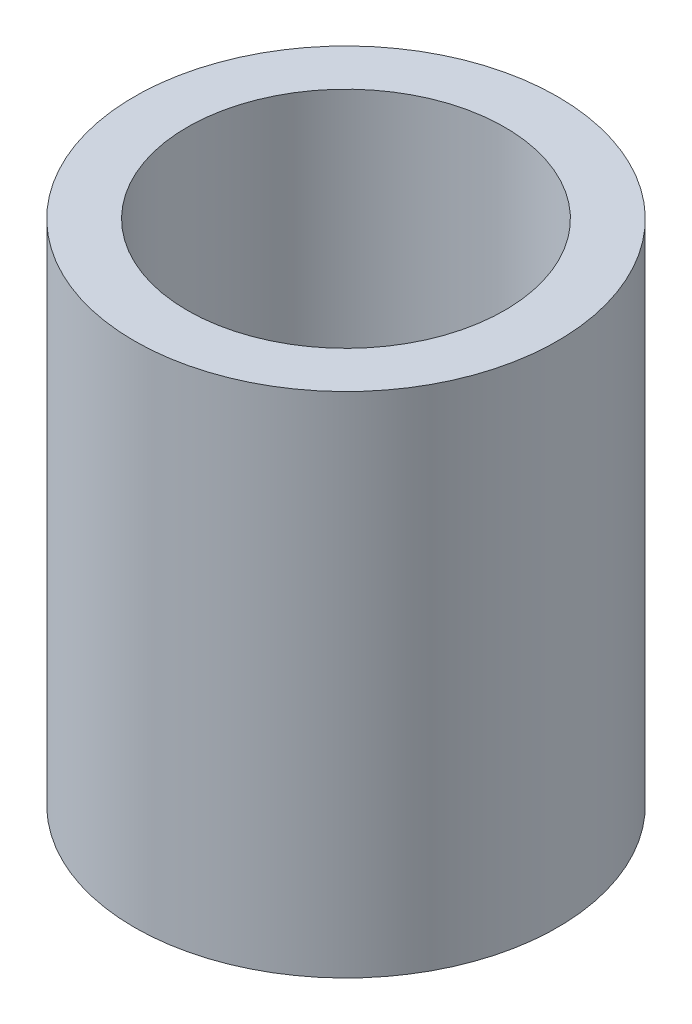
ISO-10303-21;
HEADER;
FILE_DESCRIPTION(('STEP AP214'),'2;1');
FILE_NAME('part.step','',(''),(''),'','','');
FILE_SCHEMA(('AUTOMOTIVE_DESIGN { 1 0 10303 214 1 1 1 1 }'));
ENDSEC;
DATA;
#1=APPLICATION_CONTEXT('core data for automotive mechanical design processes');
#2=APPLICATION_PROTOCOL_DEFINITION('international standard','automotive_design',2000,#1);
#3=PRODUCT_CONTEXT('',#1,'mechanical');
#4=PRODUCT('Part','Part','',(#3));
#5=PRODUCT_RELATED_PRODUCT_CATEGORY('part','',(#4));
#6=PRODUCT_DEFINITION_FORMATION('','',#4);
#7=PRODUCT_DEFINITION_CONTEXT('part definition',#1,'design');
#8=PRODUCT_DEFINITION('design','',#6,#7);
#9=PRODUCT_DEFINITION_SHAPE('','',#8);
#10=(LENGTH_UNIT() NAMED_UNIT(*) SI_UNIT(.MILLI.,.METRE.));
#11=(NAMED_UNIT(*) PLANE_ANGLE_UNIT() SI_UNIT($,.RADIAN.));
#12=(NAMED_UNIT(*) SI_UNIT($,.STERADIAN.) SOLID_ANGLE_UNIT());
#13=UNCERTAINTY_MEASURE_WITH_UNIT(LENGTH_MEASURE(1.E-05),#10,'distance_accuracy_value','');
#14=(GEOMETRIC_REPRESENTATION_CONTEXT(3) GLOBAL_UNCERTAINTY_ASSIGNED_CONTEXT((#13)) GLOBAL_UNIT_ASSIGNED_CONTEXT((#10,
#11,#12)) REPRESENTATION_CONTEXT('',''));
#15=CARTESIAN_POINT('',(0.,0.,0.));
#16=DIRECTION('',(0.,0.,1.));
#17=DIRECTION('',(1.,0.,0.));
#18=AXIS2_PLACEMENT_3D('',#15,#16,#17);
#19=CARTESIAN_POINT('',(0.,4.8,0.));
#20=DIRECTION('',(0.,1.,0.));
#21=DIRECTION('',(0.,0.,1.));
#22=AXIS2_PLACEMENT_3D('',#19,#20,#21);
#23=PLANE('',#22);
#24=CARTESIAN_POINT('',(0.,4.8,0.));
#25=DIRECTION('',(0.,1.,0.));
#26=DIRECTION('',(0.,0.,1.));
#27=AXIS2_PLACEMENT_3D('',#24,#25,#26);
#28=CIRCLE('',#27,2.);
#29=CARTESIAN_POINT('',(0.,4.8,2.));
#30=VERTEX_POINT('',#29);
#31=EDGE_CURVE('E10',#30,#30,#28,.T.);
#32=ORIENTED_EDGE('',*,*,#31,.T.);
#33=EDGE_LOOP('',(#32));
#34=FACE_BOUND('',#33,.T.);
#35=CARTESIAN_POINT('',(0.,4.8,0.));
#36=DIRECTION('',(0.,1.,0.));
#37=DIRECTION('',(0.,0.,1.));
#38=AXIS2_PLACEMENT_3D('',#35,#36,#37);
#39=CIRCLE('',#38,1.5);
#40=CARTESIAN_POINT('',(0.,4.8,1.5));
#41=VERTEX_POINT('',#40);
#42=EDGE_CURVE('E41',#41,#41,#39,.T.);
#43=ORIENTED_EDGE('',*,*,#42,.F.);
#44=EDGE_LOOP('',(#43));
#45=FACE_BOUND('',#44,.T.);
#46=ADVANCED_FACE('F30',(#34,#45),#23,.T.);
#47=CARTESIAN_POINT('',(0.,0.,0.));
#48=DIRECTION('',(0.,1.,0.));
#49=DIRECTION('',(0.,0.,1.));
#50=AXIS2_PLACEMENT_3D('',#47,#48,#49);
#51=PLANE('',#50);
#52=CARTESIAN_POINT('',(0.,0.,0.));
#53=DIRECTION('',(0.,1.,0.));
#54=DIRECTION('',(0.,0.,1.));
#55=AXIS2_PLACEMENT_3D('',#52,#53,#54);
#56=CIRCLE('',#55,2.);
#57=CARTESIAN_POINT('',(0.,0.,2.));
#58=VERTEX_POINT('',#57);
#59=EDGE_CURVE('E34',#58,#58,#56,.T.);
#60=ORIENTED_EDGE('',*,*,#59,.F.);
#61=EDGE_LOOP('',(#60));
#62=FACE_BOUND('',#61,.T.);
#63=CARTESIAN_POINT('',(0.,0.,0.));
#64=DIRECTION('',(0.,1.,0.));
#65=DIRECTION('',(0.,0.,1.));
#66=AXIS2_PLACEMENT_3D('',#63,#64,#65);
#67=CIRCLE('',#66,1.5);
#68=CARTESIAN_POINT('',(0.,0.,1.5));
#69=VERTEX_POINT('',#68);
#70=EDGE_CURVE('E43',#69,#69,#67,.T.);
#71=ORIENTED_EDGE('',*,*,#70,.T.);
#72=EDGE_LOOP('',(#71));
#73=FACE_BOUND('',#72,.T.);
#74=ADVANCED_FACE('F53',(#62,#73),#51,.F.);
#75=CARTESIAN_POINT('',(0.,4.8,0.));
#76=DIRECTION('',(0.,-1.,0.));
#77=DIRECTION('',(0.,0.,-1.));
#78=AXIS2_PLACEMENT_3D('',#75,#76,#77);
#79=CYLINDRICAL_SURFACE('',#78,2.);
#80=ORIENTED_EDGE('',*,*,#31,.F.);
#81=EDGE_LOOP('',(#80));
#82=FACE_BOUND('',#81,.T.);
#83=ORIENTED_EDGE('',*,*,#59,.T.);
#84=EDGE_LOOP('',(#83));
#85=FACE_BOUND('',#84,.T.);
#86=ADVANCED_FACE('F32',(#82,#85),#79,.T.);
#87=CARTESIAN_POINT('',(0.,4.8,0.));
#88=DIRECTION('',(0.,-1.,0.));
#89=DIRECTION('',(0.,0.,-1.));
#90=AXIS2_PLACEMENT_3D('',#87,#88,#89);
#91=CYLINDRICAL_SURFACE('',#90,1.5);
#92=ORIENTED_EDGE('',*,*,#42,.T.);
#93=EDGE_LOOP('',(#92));
#94=FACE_BOUND('',#93,.T.);
#95=ORIENTED_EDGE('',*,*,#70,.F.);
#96=EDGE_LOOP('',(#95));
#97=FACE_BOUND('',#96,.T.);
#98=ADVANCED_FACE('F49',(#94,#97),#91,.F.);
#99=CLOSED_SHELL('',(#46,#74,#86,#98));
#100=MANIFOLD_SOLID_BREP('B2',#99);
#101=ADVANCED_BREP_SHAPE_REPRESENTATION('',(#18,#100),#14);
#102=SHAPE_DEFINITION_REPRESENTATION(#9,#101);
ENDSEC;
END-ISO-10303-21;
